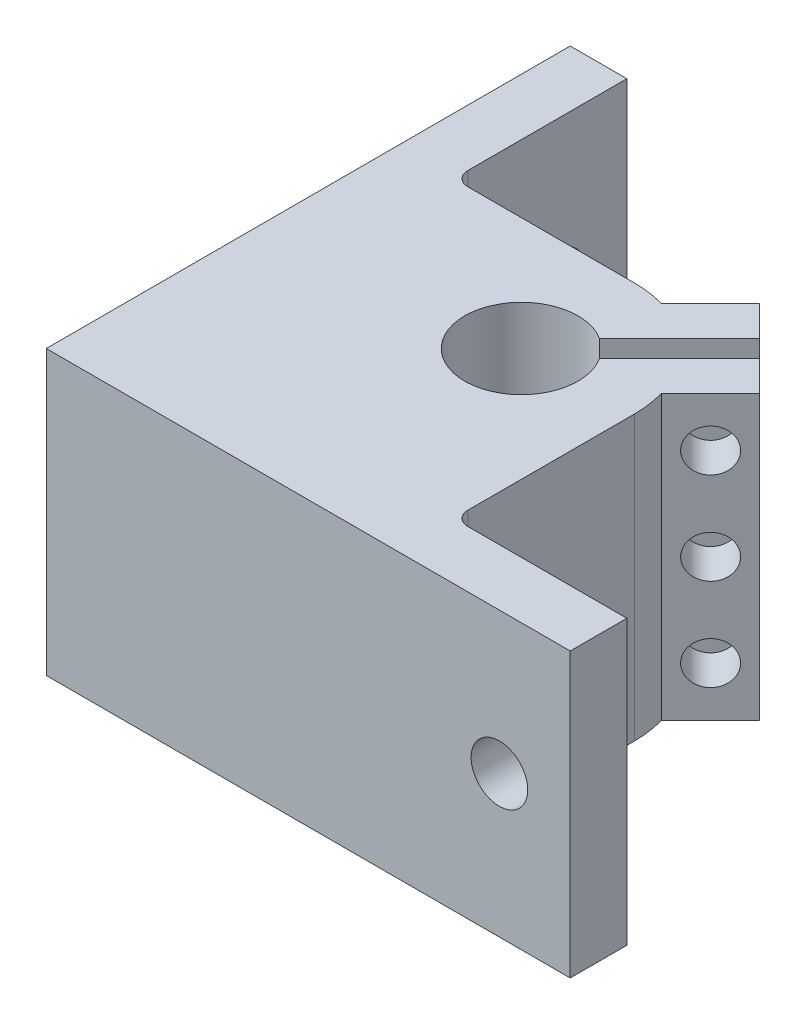
ISO-10303-21;
HEADER;
FILE_DESCRIPTION(('STEP AP214'),'2;1');
FILE_NAME('part.step','',(''),(''),'','','');
FILE_SCHEMA(('AUTOMOTIVE_DESIGN { 1 0 10303 214 1 1 1 1 }'));
ENDSEC;
DATA;
#1=APPLICATION_CONTEXT('core data for automotive mechanical design processes');
#2=APPLICATION_PROTOCOL_DEFINITION('international standard','automotive_design',2000,#1);
#3=PRODUCT_CONTEXT('',#1,'mechanical');
#4=PRODUCT('Part','Part','',(#3));
#5=PRODUCT_RELATED_PRODUCT_CATEGORY('part','',(#4));
#6=PRODUCT_DEFINITION_FORMATION('','',#4);
#7=PRODUCT_DEFINITION_CONTEXT('part definition',#1,'design');
#8=PRODUCT_DEFINITION('design','',#6,#7);
#9=PRODUCT_DEFINITION_SHAPE('','',#8);
#10=(LENGTH_UNIT() NAMED_UNIT(*) SI_UNIT(.MILLI.,.METRE.));
#11=(NAMED_UNIT(*) PLANE_ANGLE_UNIT() SI_UNIT($,.RADIAN.));
#12=(NAMED_UNIT(*) SI_UNIT($,.STERADIAN.) SOLID_ANGLE_UNIT());
#13=UNCERTAINTY_MEASURE_WITH_UNIT(LENGTH_MEASURE(1.E-05),#10,'distance_accuracy_value','');
#14=(GEOMETRIC_REPRESENTATION_CONTEXT(3) GLOBAL_UNCERTAINTY_ASSIGNED_CONTEXT((#13)) GLOBAL_UNIT_ASSIGNED_CONTEXT((#10,
#11,#12)) REPRESENTATION_CONTEXT('',''));
#15=CARTESIAN_POINT('',(0.,0.,0.));
#16=DIRECTION('',(0.,0.,1.));
#17=DIRECTION('',(1.,0.,0.));
#18=AXIS2_PLACEMENT_3D('',#15,#16,#17);
#19=CARTESIAN_POINT('',(16.775,20.,-16.775));
#20=DIRECTION('',(0.,-1.,0.));
#21=DIRECTION('',(0.,0.,-1.));
#22=AXIS2_PLACEMENT_3D('',#19,#20,#21);
#23=CYLINDRICAL_SURFACE('',#22,8.);
#24=CARTESIAN_POINT('',(16.775,0.,-16.775));
#25=DIRECTION('',(0.,1.,0.));
#26=DIRECTION('',(0.,0.,1.));
#27=AXIS2_PLACEMENT_3D('',#24,#25,#26);
#28=CIRCLE('',#27,8.);
#29=CARTESIAN_POINT('',(24.775,0.,-16.775));
#30=VERTEX_POINT('',#29);
#31=CARTESIAN_POINT('',(24.4639970008051,0.,-18.9839194466095));
#32=VERTEX_POINT('',#31);
#33=EDGE_CURVE('E89',#30,#32,#28,.T.);
#34=ORIENTED_EDGE('',*,*,#33,.T.);
#35=DIRECTION('',(0.,-1.,0.));
#36=VECTOR('',#35,1.);
#37=CARTESIAN_POINT('',(24.4639970008051,20.,-18.9839194466095));
#38=LINE('',#37,#36);
#39=CARTESIAN_POINT('',(24.4639970008051,20.,-18.9839194466095));
#40=VERTEX_POINT('',#39);
#41=EDGE_CURVE('E84',#32,#40,#38,.F.);
#42=ORIENTED_EDGE('',*,*,#41,.T.);
#43=CARTESIAN_POINT('',(16.775,20.,-16.775));
#44=DIRECTION('',(0.,1.,0.));
#45=DIRECTION('',(0.,0.,1.));
#46=AXIS2_PLACEMENT_3D('',#43,#44,#45);
#47=CIRCLE('',#46,8.);
#48=CARTESIAN_POINT('',(24.775,20.,-16.775));
#49=VERTEX_POINT('',#48);
#50=EDGE_CURVE('E205',#49,#40,#47,.T.);
#51=ORIENTED_EDGE('',*,*,#50,.F.);
#52=DIRECTION('',(0.,-1.,0.));
#53=VECTOR('',#52,1.);
#54=CARTESIAN_POINT('',(24.775,20.,-16.775));
#55=LINE('',#54,#53);
#56=EDGE_CURVE('E321',#49,#30,#55,.T.);
#57=ORIENTED_EDGE('',*,*,#56,.T.);
#58=EDGE_LOOP('',(#34,#42,#51,#57));
#59=FACE_BOUND('',#58,.T.);
#60=ADVANCED_FACE('F67',(#59),#23,.T.);
#61=CARTESIAN_POINT('',(24.775,20.,0.));
#62=DIRECTION('',(1.,0.,0.));
#63=DIRECTION('',(0.,0.,-1.));
#64=AXIS2_PLACEMENT_3D('',#61,#62,#63);
#65=PLANE('',#64);
#66=DIRECTION('',(0.,0.,1.));
#67=VECTOR('',#66,1.);
#68=CARTESIAN_POINT('',(24.775,20.,0.));
#69=LINE('',#68,#67);
#70=CARTESIAN_POINT('',(24.775,20.,-5.));
#71=VERTEX_POINT('',#70);
#72=EDGE_CURVE('E275',#49,#71,#69,.T.);
#73=ORIENTED_EDGE('',*,*,#72,.T.);
#74=DIRECTION('',(0.,-1.,0.));
#75=VECTOR('',#74,1.);
#76=CARTESIAN_POINT('',(24.775,0.,-5.));
#77=LINE('',#76,#75);
#78=CARTESIAN_POINT('',(24.775,0.,-5.));
#79=VERTEX_POINT('',#78);
#80=EDGE_CURVE('E350',#71,#79,#77,.T.);
#81=ORIENTED_EDGE('',*,*,#80,.T.);
#82=DIRECTION('',(0.,0.,1.));
#83=VECTOR('',#82,1.);
#84=CARTESIAN_POINT('',(24.775,0.,0.));
#85=LINE('',#84,#83);
#86=EDGE_CURVE('E295',#30,#79,#85,.T.);
#87=ORIENTED_EDGE('',*,*,#86,.F.);
#88=ORIENTED_EDGE('',*,*,#56,.F.);
#89=EDGE_LOOP('',(#73,#81,#87,#88));
#90=FACE_BOUND('',#89,.T.);
#91=ADVANCED_FACE('F458',(#90),#65,.T.);
#92=CARTESIAN_POINT('',(18.9839194466094,20.,-24.4639970008052));
#93=VERTEX_POINT('',#92);
#94=CARTESIAN_POINT('',(16.775,20.,-24.775));
#95=VERTEX_POINT('',#94);
#96=EDGE_CURVE('E278',#93,#95,#47,.T.);
#97=ORIENTED_EDGE('',*,*,#96,.F.);
#98=DIRECTION('',(0.,-1.,0.));
#99=VECTOR('',#98,1.);
#100=CARTESIAN_POINT('',(18.9839194466094,20.,-24.4639970008052));
#101=LINE('',#100,#99);
#102=CARTESIAN_POINT('',(18.9839194466094,0.,-24.4639970008052));
#103=VERTEX_POINT('',#102);
#104=EDGE_CURVE('E236',#93,#103,#101,.T.);
#105=ORIENTED_EDGE('',*,*,#104,.T.);
#106=CARTESIAN_POINT('',(16.775,0.,-24.775));
#107=VERTEX_POINT('',#106);
#108=EDGE_CURVE('E298',#103,#107,#28,.T.);
#109=ORIENTED_EDGE('',*,*,#108,.T.);
#110=DIRECTION('',(0.,-1.,0.));
#111=VECTOR('',#110,1.);
#112=CARTESIAN_POINT('',(16.775,20.,-24.775));
#113=LINE('',#112,#111);
#114=EDGE_CURVE('E318',#95,#107,#113,.T.);
#115=ORIENTED_EDGE('',*,*,#114,.F.);
#116=EDGE_LOOP('',(#97,#105,#109,#115));
#117=FACE_BOUND('',#116,.T.);
#118=ADVANCED_FACE('F417',(#117),#23,.T.);
#119=CARTESIAN_POINT('',(0.,20.,-24.775));
#120=DIRECTION('',(0.,0.,1.));
#121=DIRECTION('',(1.,0.,0.));
#122=AXIS2_PLACEMENT_3D('',#119,#120,#121);
#123=PLANE('',#122);
#124=DIRECTION('',(-1.,0.,0.));
#125=VECTOR('',#124,1.);
#126=CARTESIAN_POINT('',(0.,0.,-24.775));
#127=LINE('',#126,#125);
#128=CARTESIAN_POINT('',(5.,0.,-24.775));
#129=VERTEX_POINT('',#128);
#130=EDGE_CURVE('E301',#107,#129,#127,.T.);
#131=ORIENTED_EDGE('',*,*,#130,.T.);
#132=DIRECTION('',(0.,-1.,0.));
#133=VECTOR('',#132,1.);
#134=CARTESIAN_POINT('',(5.,20.,-24.775));
#135=LINE('',#134,#133);
#136=CARTESIAN_POINT('',(5.,20.,-24.775));
#137=VERTEX_POINT('',#136);
#138=EDGE_CURVE('E348',#129,#137,#135,.F.);
#139=ORIENTED_EDGE('',*,*,#138,.T.);
#140=DIRECTION('',(-1.,0.,0.));
#141=VECTOR('',#140,1.);
#142=CARTESIAN_POINT('',(0.,20.,-24.775));
#143=LINE('',#142,#141);
#144=EDGE_CURVE('E281',#95,#137,#143,.T.);
#145=ORIENTED_EDGE('',*,*,#144,.F.);
#146=ORIENTED_EDGE('',*,*,#114,.T.);
#147=EDGE_LOOP('',(#131,#139,#145,#146));
#148=FACE_BOUND('',#147,.T.);
#149=ADVANCED_FACE('F467',(#148),#123,.F.);
#150=CARTESIAN_POINT('',(0.,20.,0.));
#151=DIRECTION('',(0.,0.,-1.));
#152=DIRECTION('',(-1.,0.,0.));
#153=AXIS2_PLACEMENT_3D('',#150,#151,#152);
#154=PLANE('',#153);
#155=CARTESIAN_POINT('',(32.,10.,0.));
#156=DIRECTION('',(0.,0.,-1.));
#157=DIRECTION('',(-1.,0.,0.));
#158=AXIS2_PLACEMENT_3D('',#155,#156,#157);
#159=CIRCLE('',#158,2.);
#160=CARTESIAN_POINT('',(30.,10.,0.));
#161=VERTEX_POINT('',#160);
#162=EDGE_CURVE('E271',#161,#161,#159,.T.);
#163=ORIENTED_EDGE('',*,*,#162,.T.);
#164=EDGE_LOOP('',(#163));
#165=FACE_BOUND('',#164,.T.);
#166=DIRECTION('',(1.,0.,0.));
#167=VECTOR('',#166,1.);
#168=CARTESIAN_POINT('',(0.,0.,0.));
#169=LINE('',#168,#167);
#170=CARTESIAN_POINT('',(0.,0.,0.));
#171=VERTEX_POINT('',#170);
#172=CARTESIAN_POINT('',(37.,0.,0.));
#173=VERTEX_POINT('',#172);
#174=EDGE_CURVE('E304',#171,#173,#169,.T.);
#175=ORIENTED_EDGE('',*,*,#174,.T.);
#176=DIRECTION('',(0.,-1.,0.));
#177=VECTOR('',#176,1.);
#178=CARTESIAN_POINT('',(37.,20.,0.));
#179=LINE('',#178,#177);
#180=CARTESIAN_POINT('',(37.,20.,0.));
#181=VERTEX_POINT('',#180);
#182=EDGE_CURVE('E315',#181,#173,#179,.T.);
#183=ORIENTED_EDGE('',*,*,#182,.F.);
#184=DIRECTION('',(1.,0.,0.));
#185=VECTOR('',#184,1.);
#186=CARTESIAN_POINT('',(0.,20.,0.));
#187=LINE('',#186,#185);
#188=CARTESIAN_POINT('',(0.,20.,0.));
#189=VERTEX_POINT('',#188);
#190=EDGE_CURVE('E284',#189,#181,#187,.T.);
#191=ORIENTED_EDGE('',*,*,#190,.F.);
#192=DIRECTION('',(0.,-1.,0.));
#193=VECTOR('',#192,1.);
#194=CARTESIAN_POINT('',(0.,20.,0.));
#195=LINE('',#194,#193);
#196=EDGE_CURVE('E333',#189,#171,#195,.T.);
#197=ORIENTED_EDGE('',*,*,#196,.T.);
#198=EDGE_LOOP('',(#175,#183,#191,#197));
#199=FACE_BOUND('',#198,.T.);
#200=ADVANCED_FACE('F442',(#165,#199),#154,.F.);
#201=CARTESIAN_POINT('',(37.,20.,0.));
#202=DIRECTION('',(-1.,0.,0.));
#203=DIRECTION('',(0.,0.,1.));
#204=AXIS2_PLACEMENT_3D('',#201,#202,#203);
#205=PLANE('',#204);
#206=DIRECTION('',(0.,0.,-1.));
#207=VECTOR('',#206,1.);
#208=CARTESIAN_POINT('',(37.,0.,0.));
#209=LINE('',#208,#207);
#210=CARTESIAN_POINT('',(37.,0.,-4.));
#211=VERTEX_POINT('',#210);
#212=EDGE_CURVE('E306',#173,#211,#209,.T.);
#213=ORIENTED_EDGE('',*,*,#212,.T.);
#214=DIRECTION('',(0.,-1.,0.));
#215=VECTOR('',#214,1.);
#216=CARTESIAN_POINT('',(37.,20.,-4.));
#217=LINE('',#216,#215);
#218=CARTESIAN_POINT('',(37.,20.,-4.));
#219=VERTEX_POINT('',#218);
#220=EDGE_CURVE('E294',#219,#211,#217,.T.);
#221=ORIENTED_EDGE('',*,*,#220,.F.);
#222=DIRECTION('',(0.,0.,-1.));
#223=VECTOR('',#222,1.);
#224=CARTESIAN_POINT('',(37.,20.,0.));
#225=LINE('',#224,#223);
#226=EDGE_CURVE('E286',#181,#219,#225,.T.);
#227=ORIENTED_EDGE('',*,*,#226,.F.);
#228=ORIENTED_EDGE('',*,*,#182,.T.);
#229=EDGE_LOOP('',(#213,#221,#227,#228));
#230=FACE_BOUND('',#229,.T.);
#231=ADVANCED_FACE('F449',(#230),#205,.F.);
#232=CARTESIAN_POINT('',(0.,20.,-4.));
#233=DIRECTION('',(0.,0.,-1.));
#234=DIRECTION('',(-1.,0.,0.));
#235=AXIS2_PLACEMENT_3D('',#232,#233,#234);
#236=PLANE('',#235);
#237=CARTESIAN_POINT('',(32.,10.,-4.));
#238=DIRECTION('',(0.,0.,-1.));
#239=DIRECTION('',(-1.,0.,0.));
#240=AXIS2_PLACEMENT_3D('',#237,#238,#239);
#241=CIRCLE('',#240,2.);
#242=CARTESIAN_POINT('',(30.,10.,-4.));
#243=VERTEX_POINT('',#242);
#244=EDGE_CURVE('E268',#243,#243,#241,.T.);
#245=ORIENTED_EDGE('',*,*,#244,.F.);
#246=EDGE_LOOP('',(#245));
#247=FACE_BOUND('',#246,.T.);
#248=DIRECTION('',(1.,0.,0.));
#249=VECTOR('',#248,1.);
#250=CARTESIAN_POINT('',(0.,0.,-4.));
#251=LINE('',#250,#249);
#252=CARTESIAN_POINT('',(25.775,0.,-4.));
#253=VERTEX_POINT('',#252);
#254=EDGE_CURVE('E309',#253,#211,#251,.T.);
#255=ORIENTED_EDGE('',*,*,#254,.F.);
#256=DIRECTION('',(0.,-1.,0.));
#257=VECTOR('',#256,1.);
#258=CARTESIAN_POINT('',(25.775,20.,-4.));
#259=LINE('',#258,#257);
#260=CARTESIAN_POINT('',(25.775,20.,-4.));
#261=VERTEX_POINT('',#260);
#262=EDGE_CURVE('E353',#253,#261,#259,.F.);
#263=ORIENTED_EDGE('',*,*,#262,.T.);
#264=DIRECTION('',(1.,0.,0.));
#265=VECTOR('',#264,1.);
#266=CARTESIAN_POINT('',(0.,20.,-4.));
#267=LINE('',#266,#265);
#268=EDGE_CURVE('E289',#261,#219,#267,.T.);
#269=ORIENTED_EDGE('',*,*,#268,.T.);
#270=ORIENTED_EDGE('',*,*,#220,.T.);
#271=EDGE_LOOP('',(#255,#263,#269,#270));
#272=FACE_BOUND('',#271,.T.);
#273=ADVANCED_FACE('F453',(#247,#272),#236,.T.);
#274=CARTESIAN_POINT('',(16.775,20.,-16.775));
#275=DIRECTION('',(0.,-1.,0.));
#276=DIRECTION('',(0.,0.,-1.));
#277=AXIS2_PLACEMENT_3D('',#274,#275,#276);
#278=CYLINDRICAL_SURFACE('',#277,4.);
#279=DIRECTION('',(0.,-1.,0.));
#280=VECTOR('',#279,1.);
#281=CARTESIAN_POINT('',(20.1536437042657,20.,-18.9162068371892));
#282=LINE('',#281,#280);
#283=CARTESIAN_POINT('',(20.1536437042657,20.,-18.9162068371892));
#284=VERTEX_POINT('',#283);
#285=CARTESIAN_POINT('',(20.1536437042657,0.,-18.9162068371892));
#286=VERTEX_POINT('',#285);
#287=EDGE_CURVE('E251',#284,#286,#282,.T.);
#288=ORIENTED_EDGE('',*,*,#287,.T.);
#289=CARTESIAN_POINT('',(16.775,0.,-16.775));
#290=DIRECTION('',(0.,1.,0.));
#291=DIRECTION('',(0.,0.,1.));
#292=AXIS2_PLACEMENT_3D('',#289,#290,#291);
#293=CIRCLE('',#292,4.);
#294=CARTESIAN_POINT('',(18.9162068371892,0.,-20.1536437042657));
#295=VERTEX_POINT('',#294);
#296=EDGE_CURVE('E279',#295,#286,#293,.T.);
#297=ORIENTED_EDGE('',*,*,#296,.F.);
#298=DIRECTION('',(0.,-1.,0.));
#299=VECTOR('',#298,1.);
#300=CARTESIAN_POINT('',(18.9162068371892,20.,-20.1536437042657));
#301=LINE('',#300,#299);
#302=CARTESIAN_POINT('',(18.9162068371892,20.,-20.1536437042657));
#303=VERTEX_POINT('',#302);
#304=EDGE_CURVE('E248',#295,#303,#301,.F.);
#305=ORIENTED_EDGE('',*,*,#304,.T.);
#306=CARTESIAN_POINT('',(16.775,20.,-16.775));
#307=DIRECTION('',(0.,1.,0.));
#308=DIRECTION('',(0.,0.,1.));
#309=AXIS2_PLACEMENT_3D('',#306,#307,#308);
#310=CIRCLE('',#309,4.);
#311=EDGE_CURVE('E291',#303,#284,#310,.T.);
#312=ORIENTED_EDGE('',*,*,#311,.T.);
#313=EDGE_LOOP('',(#288,#297,#305,#312));
#314=FACE_BOUND('',#313,.T.);
#315=ADVANCED_FACE('F402',(#314),#278,.F.);
#316=CARTESIAN_POINT('',(0.,20.,0.));
#317=DIRECTION('',(0.,1.,0.));
#318=DIRECTION('',(0.,0.,1.));
#319=AXIS2_PLACEMENT_3D('',#316,#317,#318);
#320=PLANE('',#319);
#321=ORIENTED_EDGE('',*,*,#50,.T.);
#322=DIRECTION('',(0.707106781186547,0.,-0.707106781186548));
#323=VECTOR('',#322,1.);
#324=CARTESIAN_POINT('',(27.9318182973177,20.,-22.451740743122));
#325=LINE('',#324,#323);
#326=CARTESIAN_POINT('',(27.9318182973177,20.,-22.451740743122));
#327=VERTEX_POINT('',#326);
#328=EDGE_CURVE('E198',#40,#327,#325,.T.);
#329=ORIENTED_EDGE('',*,*,#328,.T.);
#330=DIRECTION('',(-0.707106781186548,0.,-0.707106781186548));
#331=VECTOR('',#330,1.);
#332=CARTESIAN_POINT('',(25.810497953758,20.,-24.5730610866817));
#333=LINE('',#332,#331);
#334=CARTESIAN_POINT('',(25.810497953758,20.,-24.5730610866817));
#335=VERTEX_POINT('',#334);
#336=EDGE_CURVE('E203',#327,#335,#333,.T.);
#337=ORIENTED_EDGE('',*,*,#336,.T.);
#338=DIRECTION('',(0.707106781186552,0.,-0.707106781186543));
#339=VECTOR('',#338,1.);
#340=CARTESIAN_POINT('',(24.396284391385,20.,-23.1588475243085));
#341=LINE('',#340,#339);
#342=EDGE_CURVE('E256',#284,#335,#341,.T.);
#343=ORIENTED_EDGE('',*,*,#342,.F.);
#344=ORIENTED_EDGE('',*,*,#311,.F.);
#345=DIRECTION('',(-0.707106781186551,0.,0.707106781186544));
#346=VECTOR('',#345,1.);
#347=CARTESIAN_POINT('',(18.9162068371892,20.,-20.1536437042657));
#348=LINE('',#347,#346);
#349=CARTESIAN_POINT('',(24.5730610866816,20.,-25.810497953758));
#350=VERTEX_POINT('',#349);
#351=EDGE_CURVE('E258',#350,#303,#348,.T.);
#352=ORIENTED_EDGE('',*,*,#351,.F.);
#353=DIRECTION('',(-0.707106781186548,0.,-0.707106781186548));
#354=VECTOR('',#353,1.);
#355=CARTESIAN_POINT('',(24.5730610866816,20.,-25.810497953758));
#356=LINE('',#355,#354);
#357=CARTESIAN_POINT('',(22.451740743122,20.,-27.9318182973177));
#358=VERTEX_POINT('',#357);
#359=EDGE_CURVE('E229',#350,#358,#356,.T.);
#360=ORIENTED_EDGE('',*,*,#359,.T.);
#361=DIRECTION('',(-0.707106781186547,0.,0.707106781186547));
#362=VECTOR('',#361,1.);
#363=CARTESIAN_POINT('',(22.451740743122,20.,-27.9318182973177));
#364=LINE('',#363,#362);
#365=EDGE_CURVE('E239',#358,#93,#364,.T.);
#366=ORIENTED_EDGE('',*,*,#365,.T.);
#367=ORIENTED_EDGE('',*,*,#96,.T.);
#368=ORIENTED_EDGE('',*,*,#144,.T.);
#369=CARTESIAN_POINT('',(5.,20.,-25.775));
#370=DIRECTION('',(0.,1.,0.));
#371=DIRECTION('',(0.,0.,1.));
#372=AXIS2_PLACEMENT_3D('',#369,#370,#371);
#373=CIRCLE('',#372,1.);
#374=CARTESIAN_POINT('',(4.,20.,-25.775));
#375=VERTEX_POINT('',#374);
#376=EDGE_CURVE('E357',#137,#375,#373,.F.);
#377=ORIENTED_EDGE('',*,*,#376,.T.);
#378=DIRECTION('',(0.,0.,-1.));
#379=VECTOR('',#378,1.);
#380=CARTESIAN_POINT('',(4.,20.,0.));
#381=LINE('',#380,#379);
#382=CARTESIAN_POINT('',(4.,20.,-37.));
#383=VERTEX_POINT('',#382);
#384=EDGE_CURVE('E324',#375,#383,#381,.T.);
#385=ORIENTED_EDGE('',*,*,#384,.T.);
#386=DIRECTION('',(1.,0.,0.));
#387=VECTOR('',#386,1.);
#388=CARTESIAN_POINT('',(0.,20.,-37.));
#389=LINE('',#388,#387);
#390=CARTESIAN_POINT('',(0.,20.,-37.));
#391=VERTEX_POINT('',#390);
#392=EDGE_CURVE('E326',#391,#383,#389,.T.);
#393=ORIENTED_EDGE('',*,*,#392,.F.);
#394=DIRECTION('',(0.,0.,-1.));
#395=VECTOR('',#394,1.);
#396=CARTESIAN_POINT('',(0.,20.,0.));
#397=LINE('',#396,#395);
#398=EDGE_CURVE('E330',#189,#391,#397,.T.);
#399=ORIENTED_EDGE('',*,*,#398,.F.);
#400=ORIENTED_EDGE('',*,*,#190,.T.);
#401=ORIENTED_EDGE('',*,*,#226,.T.);
#402=ORIENTED_EDGE('',*,*,#268,.F.);
#403=CARTESIAN_POINT('',(25.775,20.,-5.));
#404=DIRECTION('',(0.,1.,0.));
#405=DIRECTION('',(0.,0.,1.));
#406=AXIS2_PLACEMENT_3D('',#403,#404,#405);
#407=CIRCLE('',#406,1.);
#408=EDGE_CURVE('E12',#261,#71,#407,.F.);
#409=ORIENTED_EDGE('',*,*,#408,.T.);
#410=ORIENTED_EDGE('',*,*,#72,.F.);
#411=EDGE_LOOP('',(#321,#329,#337,#343,#344,#352,#360,#366,#367,#368,#377,#385,#393,#399,#400,
#401,#402,#409,#410));
#412=FACE_BOUND('',#411,.T.);
#413=ADVANCED_FACE('F200',(#412),#320,.T.);
#414=CARTESIAN_POINT('',(0.,0.,0.));
#415=DIRECTION('',(0.,1.,0.));
#416=DIRECTION('',(0.,0.,1.));
#417=AXIS2_PLACEMENT_3D('',#414,#415,#416);
#418=PLANE('',#417);
#419=DIRECTION('',(-0.707106781186552,0.,0.707106781186543));
#420=VECTOR('',#419,1.);
#421=CARTESIAN_POINT('',(24.396284391385,0.,-23.1588475243085));
#422=LINE('',#421,#420);
#423=CARTESIAN_POINT('',(25.810497953758,0.,-24.5730610866817));
#424=VERTEX_POINT('',#423);
#425=EDGE_CURVE('E254',#424,#286,#422,.T.);
#426=ORIENTED_EDGE('',*,*,#425,.F.);
#427=DIRECTION('',(0.707106781186548,0.,0.707106781186548));
#428=VECTOR('',#427,1.);
#429=CARTESIAN_POINT('',(25.810497953758,0.,-24.5730610866817));
#430=LINE('',#429,#428);
#431=CARTESIAN_POINT('',(27.9318182973177,0.,-22.451740743122));
#432=VERTEX_POINT('',#431);
#433=EDGE_CURVE('E226',#424,#432,#430,.T.);
#434=ORIENTED_EDGE('',*,*,#433,.T.);
#435=DIRECTION('',(-0.707106781186547,0.,0.707106781186548));
#436=VECTOR('',#435,1.);
#437=CARTESIAN_POINT('',(27.9318182973177,0.,-22.451740743122));
#438=LINE('',#437,#436);
#439=EDGE_CURVE('E214',#432,#32,#438,.T.);
#440=ORIENTED_EDGE('',*,*,#439,.T.);
#441=ORIENTED_EDGE('',*,*,#33,.F.);
#442=ORIENTED_EDGE('',*,*,#86,.T.);
#443=CARTESIAN_POINT('',(25.775,0.,-5.));
#444=DIRECTION('',(0.,1.,0.));
#445=DIRECTION('',(0.,0.,1.));
#446=AXIS2_PLACEMENT_3D('',#443,#444,#445);
#447=CIRCLE('',#446,1.);
#448=EDGE_CURVE('E76',#79,#253,#447,.T.);
#449=ORIENTED_EDGE('',*,*,#448,.T.);
#450=ORIENTED_EDGE('',*,*,#254,.T.);
#451=ORIENTED_EDGE('',*,*,#212,.F.);
#452=ORIENTED_EDGE('',*,*,#174,.F.);
#453=DIRECTION('',(0.,0.,-1.));
#454=VECTOR('',#453,1.);
#455=CARTESIAN_POINT('',(0.,0.,0.));
#456=LINE('',#455,#454);
#457=CARTESIAN_POINT('',(0.,0.,-37.));
#458=VERTEX_POINT('',#457);
#459=EDGE_CURVE('E327',#171,#458,#456,.T.);
#460=ORIENTED_EDGE('',*,*,#459,.T.);
#461=DIRECTION('',(1.,0.,0.));
#462=VECTOR('',#461,1.);
#463=CARTESIAN_POINT('',(0.,0.,-37.));
#464=LINE('',#463,#462);
#465=CARTESIAN_POINT('',(4.,0.,-37.));
#466=VERTEX_POINT('',#465);
#467=EDGE_CURVE('E335',#458,#466,#464,.T.);
#468=ORIENTED_EDGE('',*,*,#467,.T.);
#469=DIRECTION('',(0.,0.,-1.));
#470=VECTOR('',#469,1.);
#471=CARTESIAN_POINT('',(4.,0.,0.));
#472=LINE('',#471,#470);
#473=CARTESIAN_POINT('',(4.,0.,-25.775));
#474=VERTEX_POINT('',#473);
#475=EDGE_CURVE('E274',#474,#466,#472,.T.);
#476=ORIENTED_EDGE('',*,*,#475,.F.);
#477=CARTESIAN_POINT('',(5.,0.,-25.775));
#478=DIRECTION('',(0.,1.,0.));
#479=DIRECTION('',(0.,0.,1.));
#480=AXIS2_PLACEMENT_3D('',#477,#478,#479);
#481=CIRCLE('',#480,1.);
#482=EDGE_CURVE('E355',#474,#129,#481,.T.);
#483=ORIENTED_EDGE('',*,*,#482,.T.);
#484=ORIENTED_EDGE('',*,*,#130,.F.);
#485=ORIENTED_EDGE('',*,*,#108,.F.);
#486=DIRECTION('',(0.707106781186548,0.,-0.707106781186548));
#487=VECTOR('',#486,1.);
#488=CARTESIAN_POINT('',(22.451740743122,0.,-27.9318182973177));
#489=LINE('',#488,#487);
#490=CARTESIAN_POINT('',(22.451740743122,0.,-27.9318182973177));
#491=VERTEX_POINT('',#490);
#492=EDGE_CURVE('E233',#103,#491,#489,.T.);
#493=ORIENTED_EDGE('',*,*,#492,.T.);
#494=DIRECTION('',(0.707106781186548,0.,0.707106781186548));
#495=VECTOR('',#494,1.);
#496=CARTESIAN_POINT('',(24.5730610866816,0.,-25.810497953758));
#497=LINE('',#496,#495);
#498=CARTESIAN_POINT('',(24.5730610866816,0.,-25.810497953758));
#499=VERTEX_POINT('',#498);
#500=EDGE_CURVE('E230',#491,#499,#497,.T.);
#501=ORIENTED_EDGE('',*,*,#500,.T.);
#502=DIRECTION('',(0.707106781186551,0.,-0.707106781186544));
#503=VECTOR('',#502,1.);
#504=CARTESIAN_POINT('',(18.9162068371892,0.,-20.1536437042657));
#505=LINE('',#504,#503);
#506=EDGE_CURVE('E260',#295,#499,#505,.T.);
#507=ORIENTED_EDGE('',*,*,#506,.F.);
#508=ORIENTED_EDGE('',*,*,#296,.T.);
#509=EDGE_LOOP('',(#426,#434,#440,#441,#442,#449,#450,#451,#452,#460,#468,#476,#483,#484,#485,
#493,#501,#507,#508));
#510=FACE_BOUND('',#509,.T.);
#511=ADVANCED_FACE('F394',(#510),#418,.F.);
#512=CARTESIAN_POINT('',(0.,20.,0.));
#513=DIRECTION('',(-1.,0.,0.));
#514=DIRECTION('',(0.,0.,1.));
#515=AXIS2_PLACEMENT_3D('',#512,#513,#514);
#516=PLANE('',#515);
#517=CARTESIAN_POINT('',(0.,10.,-32.));
#518=DIRECTION('',(-1.,0.,0.));
#519=DIRECTION('',(0.,0.,1.));
#520=AXIS2_PLACEMENT_3D('',#517,#518,#519);
#521=CIRCLE('',#520,2.);
#522=CARTESIAN_POINT('',(0.,10.,-30.));
#523=VERTEX_POINT('',#522);
#524=EDGE_CURVE('E265',#523,#523,#521,.T.);
#525=ORIENTED_EDGE('',*,*,#524,.F.);
#526=EDGE_LOOP('',(#525));
#527=FACE_BOUND('',#526,.T.);
#528=ORIENTED_EDGE('',*,*,#459,.F.);
#529=ORIENTED_EDGE('',*,*,#196,.F.);
#530=ORIENTED_EDGE('',*,*,#398,.T.);
#531=DIRECTION('',(0.,-1.,0.));
#532=VECTOR('',#531,1.);
#533=CARTESIAN_POINT('',(0.,20.,-37.));
#534=LINE('',#533,#532);
#535=EDGE_CURVE('E342',#391,#458,#534,.T.);
#536=ORIENTED_EDGE('',*,*,#535,.T.);
#537=EDGE_LOOP('',(#528,#529,#530,#536));
#538=FACE_BOUND('',#537,.T.);
#539=ADVANCED_FACE('F440',(#527,#538),#516,.T.);
#540=CARTESIAN_POINT('',(0.,20.,-37.));
#541=DIRECTION('',(0.,0.,-1.));
#542=DIRECTION('',(-1.,0.,0.));
#543=AXIS2_PLACEMENT_3D('',#540,#541,#542);
#544=PLANE('',#543);
#545=ORIENTED_EDGE('',*,*,#467,.F.);
#546=ORIENTED_EDGE('',*,*,#535,.F.);
#547=ORIENTED_EDGE('',*,*,#392,.T.);
#548=DIRECTION('',(0.,-1.,0.));
#549=VECTOR('',#548,1.);
#550=CARTESIAN_POINT('',(4.,20.,-37.));
#551=LINE('',#550,#549);
#552=EDGE_CURVE('E299',#383,#466,#551,.T.);
#553=ORIENTED_EDGE('',*,*,#552,.T.);
#554=EDGE_LOOP('',(#545,#546,#547,#553));
#555=FACE_BOUND('',#554,.T.);
#556=ADVANCED_FACE('F435',(#555),#544,.T.);
#557=CARTESIAN_POINT('',(4.,20.,0.));
#558=DIRECTION('',(-1.,0.,0.));
#559=DIRECTION('',(0.,0.,1.));
#560=AXIS2_PLACEMENT_3D('',#557,#558,#559);
#561=PLANE('',#560);
#562=CARTESIAN_POINT('',(4.,10.,-32.));
#563=DIRECTION('',(1.,0.,0.));
#564=DIRECTION('',(0.,0.,-1.));
#565=AXIS2_PLACEMENT_3D('',#562,#563,#564);
#566=CIRCLE('',#565,2.);
#567=CARTESIAN_POINT('',(4.,10.,-34.));
#568=VERTEX_POINT('',#567);
#569=EDGE_CURVE('E262',#568,#568,#566,.T.);
#570=ORIENTED_EDGE('',*,*,#569,.F.);
#571=EDGE_LOOP('',(#570));
#572=FACE_BOUND('',#571,.T.);
#573=ORIENTED_EDGE('',*,*,#384,.F.);
#574=DIRECTION('',(0.,-1.,0.));
#575=VECTOR('',#574,1.);
#576=CARTESIAN_POINT('',(4.,0.,-25.775));
#577=LINE('',#576,#575);
#578=EDGE_CURVE('E323',#375,#474,#577,.T.);
#579=ORIENTED_EDGE('',*,*,#578,.T.);
#580=ORIENTED_EDGE('',*,*,#475,.T.);
#581=ORIENTED_EDGE('',*,*,#552,.F.);
#582=EDGE_LOOP('',(#573,#579,#580,#581));
#583=FACE_BOUND('',#582,.T.);
#584=ADVANCED_FACE('F429',(#572,#583),#561,.F.);
#585=CARTESIAN_POINT('',(5.,20.,-25.775));
#586=DIRECTION('',(0.,1.,0.));
#587=DIRECTION('',(0.,0.,1.));
#588=AXIS2_PLACEMENT_3D('',#585,#586,#587);
#589=CYLINDRICAL_SURFACE('',#588,1.);
#590=ORIENTED_EDGE('',*,*,#376,.F.);
#591=ORIENTED_EDGE('',*,*,#138,.F.);
#592=ORIENTED_EDGE('',*,*,#482,.F.);
#593=ORIENTED_EDGE('',*,*,#578,.F.);
#594=EDGE_LOOP('',(#590,#591,#592,#593));
#595=FACE_BOUND('',#594,.T.);
#596=ADVANCED_FACE('F426',(#595),#589,.F.);
#597=CARTESIAN_POINT('',(25.775,20.,-5.));
#598=DIRECTION('',(0.,1.,0.));
#599=DIRECTION('',(0.,0.,1.));
#600=AXIS2_PLACEMENT_3D('',#597,#598,#599);
#601=CYLINDRICAL_SURFACE('',#600,1.);
#602=ORIENTED_EDGE('',*,*,#408,.F.);
#603=ORIENTED_EDGE('',*,*,#262,.F.);
#604=ORIENTED_EDGE('',*,*,#448,.F.);
#605=ORIENTED_EDGE('',*,*,#80,.F.);
#606=EDGE_LOOP('',(#602,#603,#604,#605));
#607=FACE_BOUND('',#606,.T.);
#608=ADVANCED_FACE('F69',(#607),#601,.F.);
#609=CARTESIAN_POINT('',(32.,10.,16.));
#610=DIRECTION('',(0.,0.,-1.));
#611=DIRECTION('',(-1.,0.,0.));
#612=AXIS2_PLACEMENT_3D('',#609,#610,#611);
#613=CYLINDRICAL_SURFACE('',#612,2.);
#614=ORIENTED_EDGE('',*,*,#244,.T.);
#615=EDGE_LOOP('',(#614));
#616=FACE_BOUND('',#615,.T.);
#617=ORIENTED_EDGE('',*,*,#162,.F.);
#618=EDGE_LOOP('',(#617));
#619=FACE_BOUND('',#618,.T.);
#620=ADVANCED_FACE('F489',(#616,#619),#613,.F.);
#621=CARTESIAN_POINT('',(-16.,10.,-32.));
#622=DIRECTION('',(1.,0.,0.));
#623=DIRECTION('',(0.,0.,-1.));
#624=AXIS2_PLACEMENT_3D('',#621,#622,#623);
#625=CYLINDRICAL_SURFACE('',#624,2.);
#626=ORIENTED_EDGE('',*,*,#524,.T.);
#627=EDGE_LOOP('',(#626));
#628=FACE_BOUND('',#627,.T.);
#629=ORIENTED_EDGE('',*,*,#569,.T.);
#630=EDGE_LOOP('',(#629));
#631=FACE_BOUND('',#630,.T.);
#632=ADVANCED_FACE('F486',(#628,#631),#625,.F.);
#633=CARTESIAN_POINT('',(18.9162068371892,-0.001000000000001,-20.1536437042657));
#634=DIRECTION('',(-0.707106781186544,0.,-0.707106781186551));
#635=DIRECTION('',(-0.707106781186551,0.,0.707106781186544));
#636=AXIS2_PLACEMENT_3D('',#633,#634,#635);
#637=PLANE('',#636);
#638=CARTESIAN_POINT('',(22.8391504384254,16.5,-24.0765873055018));
#639=DIRECTION('',(-0.707106781186544,0.,-0.707106781186551));
#640=DIRECTION('',(-0.707106781186551,0.,0.707106781186544));
#641=AXIS2_PLACEMENT_3D('',#638,#639,#640);
#642=CIRCLE('',#641,1.5);
#643=CARTESIAN_POINT('',(21.7784902666456,16.5,-23.0159271337219));
#644=VERTEX_POINT('',#643);
#645=EDGE_CURVE('E207',#644,#644,#642,.T.);
#646=ORIENTED_EDGE('',*,*,#645,.T.);
#647=EDGE_LOOP('',(#646));
#648=FACE_BOUND('',#647,.T.);
#649=CARTESIAN_POINT('',(22.8391504384254,10.,-24.0765873055018));
#650=DIRECTION('',(-0.707106781186544,0.,-0.707106781186551));
#651=DIRECTION('',(-0.707106781186551,0.,0.707106781186544));
#652=AXIS2_PLACEMENT_3D('',#649,#650,#651);
#653=CIRCLE('',#652,1.5);
#654=CARTESIAN_POINT('',(21.7784902666456,10.,-23.0159271337219));
#655=VERTEX_POINT('',#654);
#656=EDGE_CURVE('E383',#655,#655,#653,.T.);
#657=ORIENTED_EDGE('',*,*,#656,.T.);
#658=EDGE_LOOP('',(#657));
#659=FACE_BOUND('',#658,.T.);
#660=CARTESIAN_POINT('',(22.8391504384254,3.5,-24.0765873055018));
#661=DIRECTION('',(-0.707106781186544,0.,-0.707106781186551));
#662=DIRECTION('',(-0.707106781186551,0.,0.707106781186544));
#663=AXIS2_PLACEMENT_3D('',#660,#661,#662);
#664=CIRCLE('',#663,1.5);
#665=CARTESIAN_POINT('',(21.7784902666456,3.5,-23.0159271337219));
#666=VERTEX_POINT('',#665);
#667=EDGE_CURVE('E366',#666,#666,#664,.T.);
#668=ORIENTED_EDGE('',*,*,#667,.T.);
#669=EDGE_LOOP('',(#668));
#670=FACE_BOUND('',#669,.T.);
#671=ORIENTED_EDGE('',*,*,#506,.T.);
#672=DIRECTION('',(0.,1.,0.));
#673=VECTOR('',#672,1.);
#674=CARTESIAN_POINT('',(24.5730610866816,-11.,-25.810497953758));
#675=LINE('',#674,#673);
#676=EDGE_CURVE('E242',#499,#350,#675,.T.);
#677=ORIENTED_EDGE('',*,*,#676,.T.);
#678=ORIENTED_EDGE('',*,*,#351,.T.);
#679=ORIENTED_EDGE('',*,*,#304,.F.);
#680=EDGE_LOOP('',(#671,#677,#678,#679));
#681=FACE_BOUND('',#680,.T.);
#682=ADVANCED_FACE('F404',(#648,#659,#670,#681),#637,.F.);
#683=CARTESIAN_POINT('',(24.396284391385,-0.001000000000001,-23.1588475243085));
#684=DIRECTION('',(0.707106781186543,0.,0.707106781186552));
#685=DIRECTION('',(0.707106781186552,0.,-0.707106781186543));
#686=AXIS2_PLACEMENT_3D('',#683,#684,#685);
#687=PLANE('',#686);
#688=CARTESIAN_POINT('',(24.0765873055018,16.5,-22.8391504384253));
#689=DIRECTION('',(0.707106781186543,0.,0.707106781186552));
#690=DIRECTION('',(0.707106781186552,0.,-0.707106781186543));
#691=AXIS2_PLACEMENT_3D('',#688,#689,#690);
#692=CIRCLE('',#691,1.5);
#693=CARTESIAN_POINT('',(25.1372474772817,16.5,-23.8998106102051));
#694=VERTEX_POINT('',#693);
#695=EDGE_CURVE('E389',#694,#694,#692,.T.);
#696=ORIENTED_EDGE('',*,*,#695,.T.);
#697=EDGE_LOOP('',(#696));
#698=FACE_BOUND('',#697,.T.);
#699=CARTESIAN_POINT('',(24.0765873055018,10.,-22.8391504384253));
#700=DIRECTION('',(0.707106781186543,0.,0.707106781186552));
#701=DIRECTION('',(0.707106781186552,0.,-0.707106781186543));
#702=AXIS2_PLACEMENT_3D('',#699,#700,#701);
#703=CIRCLE('',#702,1.5);
#704=CARTESIAN_POINT('',(25.1372474772817,10.,-23.8998106102051));
#705=VERTEX_POINT('',#704);
#706=EDGE_CURVE('E370',#705,#705,#703,.T.);
#707=ORIENTED_EDGE('',*,*,#706,.T.);
#708=EDGE_LOOP('',(#707));
#709=FACE_BOUND('',#708,.T.);
#710=CARTESIAN_POINT('',(24.0765873055018,3.5,-22.8391504384253));
#711=DIRECTION('',(0.707106781186543,0.,0.707106781186552));
#712=DIRECTION('',(0.707106781186552,0.,-0.707106781186543));
#713=AXIS2_PLACEMENT_3D('',#710,#711,#712);
#714=CIRCLE('',#713,1.5);
#715=CARTESIAN_POINT('',(25.1372474772817,3.5,-23.8998106102051));
#716=VERTEX_POINT('',#715);
#717=EDGE_CURVE('E373',#716,#716,#714,.T.);
#718=ORIENTED_EDGE('',*,*,#717,.T.);
#719=EDGE_LOOP('',(#718));
#720=FACE_BOUND('',#719,.T.);
#721=ORIENTED_EDGE('',*,*,#342,.T.);
#722=DIRECTION('',(0.,1.,0.));
#723=VECTOR('',#722,1.);
#724=CARTESIAN_POINT('',(25.810497953758,-11.,-24.5730610866817));
#725=LINE('',#724,#723);
#726=EDGE_CURVE('E217',#424,#335,#725,.T.);
#727=ORIENTED_EDGE('',*,*,#726,.F.);
#728=ORIENTED_EDGE('',*,*,#425,.T.);
#729=ORIENTED_EDGE('',*,*,#287,.F.);
#730=EDGE_LOOP('',(#721,#727,#728,#729));
#731=FACE_BOUND('',#730,.T.);
#732=ADVANCED_FACE('F399',(#698,#709,#720,#731),#687,.F.);
#733=CARTESIAN_POINT('',(22.451740743122,-11.,-27.9318182973177));
#734=DIRECTION('',(-0.707106781186548,0.,-0.707106781186548));
#735=DIRECTION('',(-0.707106781186548,0.,0.707106781186548));
#736=AXIS2_PLACEMENT_3D('',#733,#734,#735);
#737=PLANE('',#736);
#738=CARTESIAN_POINT('',(20.7178300948657,16.5,-26.1979076490614));
#739=DIRECTION('',(-0.707106781186548,0.,-0.707106781186548));
#740=DIRECTION('',(-0.707106781186548,0.,0.707106781186548));
#741=AXIS2_PLACEMENT_3D('',#738,#739,#740);
#742=CIRCLE('',#741,1.5);
#743=CARTESIAN_POINT('',(19.6571699230859,16.5,-25.1372474772816));
#744=VERTEX_POINT('',#743);
#745=EDGE_CURVE('E386',#744,#744,#742,.T.);
#746=ORIENTED_EDGE('',*,*,#745,.F.);
#747=EDGE_LOOP('',(#746));
#748=FACE_BOUND('',#747,.T.);
#749=CARTESIAN_POINT('',(20.7178300948657,10.,-26.1979076490614));
#750=DIRECTION('',(-0.707106781186548,0.,-0.707106781186548));
#751=DIRECTION('',(-0.707106781186548,0.,0.707106781186548));
#752=AXIS2_PLACEMENT_3D('',#749,#750,#751);
#753=CIRCLE('',#752,1.5);
#754=CARTESIAN_POINT('',(19.6571699230859,10.,-25.1372474772816));
#755=VERTEX_POINT('',#754);
#756=EDGE_CURVE('E365',#755,#755,#753,.T.);
#757=ORIENTED_EDGE('',*,*,#756,.F.);
#758=EDGE_LOOP('',(#757));
#759=FACE_BOUND('',#758,.T.);
#760=CARTESIAN_POINT('',(20.7178300948657,3.5,-26.1979076490614));
#761=DIRECTION('',(-0.707106781186548,0.,-0.707106781186548));
#762=DIRECTION('',(-0.707106781186548,0.,0.707106781186548));
#763=AXIS2_PLACEMENT_3D('',#760,#761,#762);
#764=CIRCLE('',#763,1.5);
#765=CARTESIAN_POINT('',(19.6571699230859,3.5,-25.1372474772816));
#766=VERTEX_POINT('',#765);
#767=EDGE_CURVE('E362',#766,#766,#764,.T.);
#768=ORIENTED_EDGE('',*,*,#767,.F.);
#769=EDGE_LOOP('',(#768));
#770=FACE_BOUND('',#769,.T.);
#771=ORIENTED_EDGE('',*,*,#104,.F.);
#772=ORIENTED_EDGE('',*,*,#365,.F.);
#773=DIRECTION('',(0.,1.,0.));
#774=VECTOR('',#773,1.);
#775=CARTESIAN_POINT('',(22.451740743122,-11.,-27.9318182973177));
#776=LINE('',#775,#774);
#777=EDGE_CURVE('E234',#491,#358,#776,.T.);
#778=ORIENTED_EDGE('',*,*,#777,.F.);
#779=ORIENTED_EDGE('',*,*,#492,.F.);
#780=EDGE_LOOP('',(#771,#772,#778,#779));
#781=FACE_BOUND('',#780,.T.);
#782=ADVANCED_FACE('F415',(#748,#759,#770,#781),#737,.T.);
#783=CARTESIAN_POINT('',(24.5730610866816,-11.,-25.810497953758));
#784=DIRECTION('',(0.707106781186548,0.,-0.707106781186548));
#785=DIRECTION('',(-0.707106781186548,0.,-0.707106781186548));
#786=AXIS2_PLACEMENT_3D('',#783,#784,#785);
#787=PLANE('',#786);
#788=ORIENTED_EDGE('',*,*,#500,.F.);
#789=ORIENTED_EDGE('',*,*,#777,.T.);
#790=ORIENTED_EDGE('',*,*,#359,.F.);
#791=ORIENTED_EDGE('',*,*,#676,.F.);
#792=EDGE_LOOP('',(#788,#789,#790,#791));
#793=FACE_BOUND('',#792,.T.);
#794=ADVANCED_FACE('F411',(#793),#787,.T.);
#795=CARTESIAN_POINT('',(27.9318182973177,-11.,-22.451740743122));
#796=DIRECTION('',(0.707106781186548,0.,0.707106781186547));
#797=DIRECTION('',(0.707106781186547,0.,-0.707106781186548));
#798=AXIS2_PLACEMENT_3D('',#795,#796,#797);
#799=PLANE('',#798);
#800=CARTESIAN_POINT('',(26.1979076490614,16.5,-20.7178300948657));
#801=DIRECTION('',(0.707106781186548,0.,0.707106781186547));
#802=DIRECTION('',(0.707106781186547,0.,-0.707106781186548));
#803=AXIS2_PLACEMENT_3D('',#800,#801,#802);
#804=CIRCLE('',#803,1.5);
#805=CARTESIAN_POINT('',(27.2585678208412,16.5,-21.7784902666456));
#806=VERTEX_POINT('',#805);
#807=EDGE_CURVE('E71',#806,#806,#804,.T.);
#808=ORIENTED_EDGE('',*,*,#807,.F.);
#809=EDGE_LOOP('',(#808));
#810=FACE_BOUND('',#809,.T.);
#811=CARTESIAN_POINT('',(26.1979076490614,10.,-20.7178300948657));
#812=DIRECTION('',(0.707106781186548,0.,0.707106781186547));
#813=DIRECTION('',(0.707106781186547,0.,-0.707106781186548));
#814=AXIS2_PLACEMENT_3D('',#811,#812,#813);
#815=CIRCLE('',#814,1.5);
#816=CARTESIAN_POINT('',(27.2585678208412,10.,-21.7784902666456));
#817=VERTEX_POINT('',#816);
#818=EDGE_CURVE('E363',#817,#817,#815,.T.);
#819=ORIENTED_EDGE('',*,*,#818,.F.);
#820=EDGE_LOOP('',(#819));
#821=FACE_BOUND('',#820,.T.);
#822=CARTESIAN_POINT('',(26.1979076490614,3.5,-20.7178300948657));
#823=DIRECTION('',(0.707106781186548,0.,0.707106781186547));
#824=DIRECTION('',(0.707106781186547,0.,-0.707106781186548));
#825=AXIS2_PLACEMENT_3D('',#822,#823,#824);
#826=CIRCLE('',#825,1.5);
#827=CARTESIAN_POINT('',(27.2585678208412,3.5,-21.7784902666456));
#828=VERTEX_POINT('',#827);
#829=EDGE_CURVE('E360',#828,#828,#826,.T.);
#830=ORIENTED_EDGE('',*,*,#829,.F.);
#831=EDGE_LOOP('',(#830));
#832=FACE_BOUND('',#831,.T.);
#833=ORIENTED_EDGE('',*,*,#41,.F.);
#834=ORIENTED_EDGE('',*,*,#439,.F.);
#835=DIRECTION('',(0.,1.,0.));
#836=VECTOR('',#835,1.);
#837=CARTESIAN_POINT('',(27.9318182973177,-11.,-22.451740743122));
#838=LINE('',#837,#836);
#839=EDGE_CURVE('E211',#432,#327,#838,.T.);
#840=ORIENTED_EDGE('',*,*,#839,.T.);
#841=ORIENTED_EDGE('',*,*,#328,.F.);
#842=EDGE_LOOP('',(#833,#834,#840,#841));
#843=FACE_BOUND('',#842,.T.);
#844=ADVANCED_FACE('F212',(#810,#821,#832,#843),#799,.T.);
#845=CARTESIAN_POINT('',(25.810497953758,-11.,-24.5730610866817));
#846=DIRECTION('',(0.707106781186548,0.,-0.707106781186548));
#847=DIRECTION('',(-0.707106781186548,0.,-0.707106781186548));
#848=AXIS2_PLACEMENT_3D('',#845,#846,#847);
#849=PLANE('',#848);
#850=ORIENTED_EDGE('',*,*,#433,.F.);
#851=ORIENTED_EDGE('',*,*,#726,.T.);
#852=ORIENTED_EDGE('',*,*,#336,.F.);
#853=ORIENTED_EDGE('',*,*,#839,.F.);
#854=EDGE_LOOP('',(#850,#851,#852,#853));
#855=FACE_BOUND('',#854,.T.);
#856=ADVANCED_FACE('F220',(#855),#849,.T.);
#857=CARTESIAN_POINT('',(4.95786887196357,3.5,-41.9578688719636));
#858=DIRECTION('',(0.707106781186548,0.,0.707106781186547));
#859=DIRECTION('',(0.707106781186547,0.,-0.707106781186548));
#860=AXIS2_PLACEMENT_3D('',#857,#858,#859);
#861=CYLINDRICAL_SURFACE('',#860,1.5);
#862=ORIENTED_EDGE('',*,*,#829,.T.);
#863=EDGE_LOOP('',(#862));
#864=FACE_BOUND('',#863,.T.);
#865=ORIENTED_EDGE('',*,*,#717,.F.);
#866=EDGE_LOOP('',(#865));
#867=FACE_BOUND('',#866,.T.);
#868=ADVANCED_FACE('F569',(#864,#867),#861,.F.);
#869=CARTESIAN_POINT('',(4.95786887196357,10.,-41.9578688719636));
#870=DIRECTION('',(0.707106781186548,0.,0.707106781186547));
#871=DIRECTION('',(0.707106781186547,0.,-0.707106781186548));
#872=AXIS2_PLACEMENT_3D('',#869,#870,#871);
#873=CYLINDRICAL_SURFACE('',#872,1.5);
#874=ORIENTED_EDGE('',*,*,#818,.T.);
#875=EDGE_LOOP('',(#874));
#876=FACE_BOUND('',#875,.T.);
#877=ORIENTED_EDGE('',*,*,#706,.F.);
#878=EDGE_LOOP('',(#877));
#879=FACE_BOUND('',#878,.T.);
#880=ADVANCED_FACE('F607',(#876,#879),#873,.F.);
#881=CARTESIAN_POINT('',(4.95786887196357,16.5,-41.9578688719636));
#882=DIRECTION('',(0.707106781186548,0.,0.707106781186547));
#883=DIRECTION('',(0.707106781186547,0.,-0.707106781186548));
#884=AXIS2_PLACEMENT_3D('',#881,#882,#883);
#885=CYLINDRICAL_SURFACE('',#884,1.5);
#886=ORIENTED_EDGE('',*,*,#807,.T.);
#887=EDGE_LOOP('',(#886));
#888=FACE_BOUND('',#887,.T.);
#889=ORIENTED_EDGE('',*,*,#695,.F.);
#890=EDGE_LOOP('',(#889));
#891=FACE_BOUND('',#890,.T.);
#892=ADVANCED_FACE('F618',(#888,#891),#885,.F.);
#893=ORIENTED_EDGE('',*,*,#767,.T.);
#894=EDGE_LOOP('',(#893));
#895=FACE_BOUND('',#894,.T.);
#896=ORIENTED_EDGE('',*,*,#667,.F.);
#897=EDGE_LOOP('',(#896));
#898=FACE_BOUND('',#897,.T.);
#899=ADVANCED_FACE('F610',(#895,#898),#861,.F.);
#900=ORIENTED_EDGE('',*,*,#756,.T.);
#901=EDGE_LOOP('',(#900));
#902=FACE_BOUND('',#901,.T.);
#903=ORIENTED_EDGE('',*,*,#656,.F.);
#904=EDGE_LOOP('',(#903));
#905=FACE_BOUND('',#904,.T.);
#906=ADVANCED_FACE('F620',(#902,#905),#873,.F.);
#907=ORIENTED_EDGE('',*,*,#745,.T.);
#908=EDGE_LOOP('',(#907));
#909=FACE_BOUND('',#908,.T.);
#910=ORIENTED_EDGE('',*,*,#645,.F.);
#911=EDGE_LOOP('',(#910));
#912=FACE_BOUND('',#911,.T.);
#913=ADVANCED_FACE('F630',(#909,#912),#885,.F.);
#914=CLOSED_SHELL('',(#60,#91,#118,#149,#200,#231,#273,#315,#413,#511,#539,#556,#584,#596,#608,
#620,#632,#682,#732,#782,#794,#844,#856,#868,#880,#892,#899,#906,#913));
#915=MANIFOLD_SOLID_BREP('B2',#914);
#916=ADVANCED_BREP_SHAPE_REPRESENTATION('',(#18,#915),#14);
#917=SHAPE_DEFINITION_REPRESENTATION(#9,#916);
ENDSEC;
END-ISO-10303-21;
